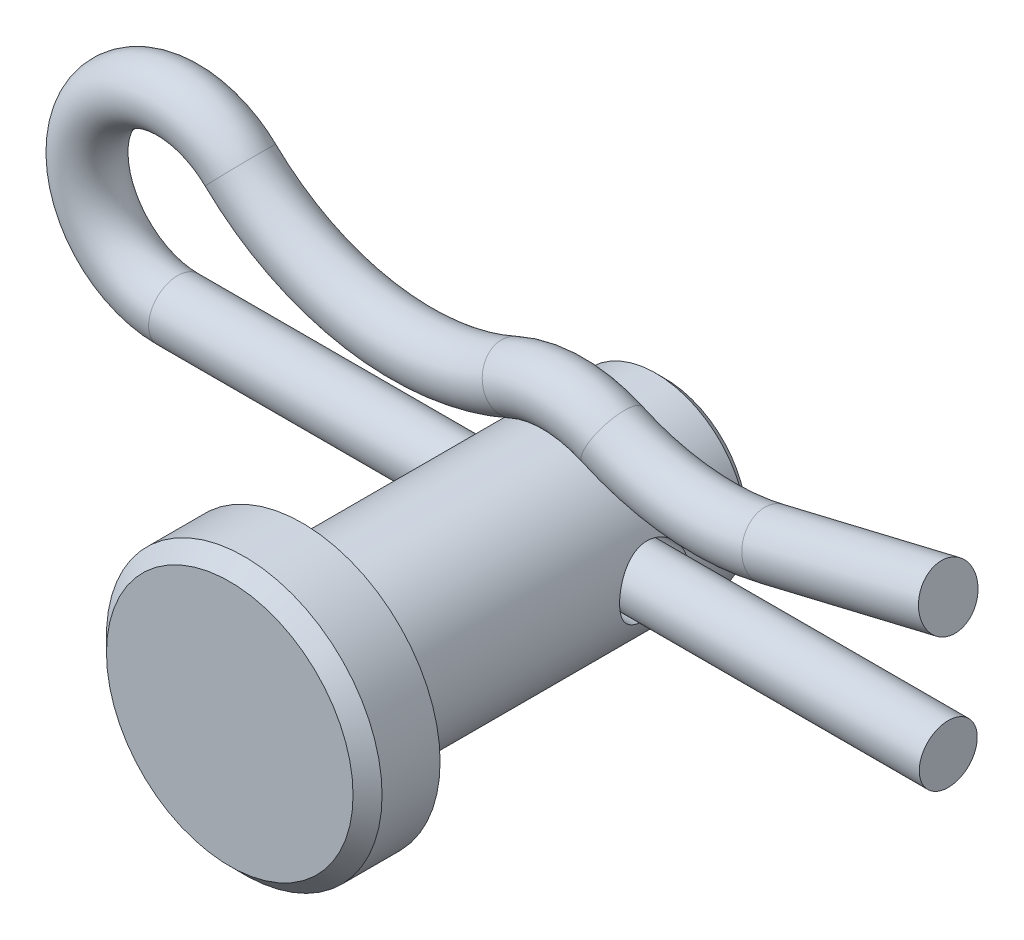
ISO-10303-21;
HEADER;
FILE_DESCRIPTION(('STEP AP214'),'2;1');
FILE_NAME('part.step','',(''),(''),'','','');
FILE_SCHEMA(('AUTOMOTIVE_DESIGN { 1 0 10303 214 1 1 1 1 }'));
ENDSEC;
DATA;
#1=APPLICATION_CONTEXT('core data for automotive mechanical design processes');
#2=APPLICATION_PROTOCOL_DEFINITION('international standard','automotive_design',2000,#1);
#3=PRODUCT_CONTEXT('',#1,'mechanical');
#4=PRODUCT('Part','Part','',(#3));
#5=PRODUCT_RELATED_PRODUCT_CATEGORY('part','',(#4));
#6=PRODUCT_DEFINITION_FORMATION('','',#4);
#7=PRODUCT_DEFINITION_CONTEXT('part definition',#1,'design');
#8=PRODUCT_DEFINITION('design','',#6,#7);
#9=PRODUCT_DEFINITION_SHAPE('','',#8);
#10=(LENGTH_UNIT() NAMED_UNIT(*) SI_UNIT(.MILLI.,.METRE.));
#11=(NAMED_UNIT(*) PLANE_ANGLE_UNIT() SI_UNIT($,.RADIAN.));
#12=(NAMED_UNIT(*) SI_UNIT($,.STERADIAN.) SOLID_ANGLE_UNIT());
#13=UNCERTAINTY_MEASURE_WITH_UNIT(LENGTH_MEASURE(1.E-05),#10,'distance_accuracy_value','');
#14=(GEOMETRIC_REPRESENTATION_CONTEXT(3) GLOBAL_UNCERTAINTY_ASSIGNED_CONTEXT((#13)) GLOBAL_UNIT_ASSIGNED_CONTEXT((#10,
#11,#12)) REPRESENTATION_CONTEXT('',''));
#15=CARTESIAN_POINT('',(0.,0.,0.));
#16=DIRECTION('',(0.,0.,1.));
#17=DIRECTION('',(1.,0.,0.));
#18=AXIS2_PLACEMENT_3D('',#15,#16,#17);
#19=CARTESIAN_POINT('',(7.30602677817418,3.28466385983467,-2.778125));
#20=DIRECTION('',(0.972644161927348,0.232300095283337,0.));
#21=DIRECTION('',(-0.232300095283337,0.972644161927348,0.));
#22=AXIS2_PLACEMENT_3D('',#19,#20,#21);
#23=CYLINDRICAL_SURFACE('',#22,1.016);
#24=CARTESIAN_POINT('',(7.30602677817418,3.28466385983467,-2.778125));
#25=DIRECTION('',(0.972644161927351,0.232300095283325,0.));
#26=DIRECTION('',(-0.232300095283325,0.972644161927351,0.));
#27=AXIS2_PLACEMENT_3D('',#24,#25,#26);
#28=CIRCLE('',#27,1.016);
#29=CARTESIAN_POINT('',(7.54204367498205,2.29645739131648,-2.778125));
#30=VERTEX_POINT('',#29);
#31=EDGE_CURVE('E44',#30,#30,#28,.T.);
#32=ORIENTED_EDGE('',*,*,#31,.T.);
#33=EDGE_LOOP('',(#32));
#34=FACE_BOUND('',#33,.T.);
#35=CARTESIAN_POINT('',(13.49375,4.76250000000001,-2.778125));
#36=DIRECTION('',(0.972644161927351,0.232300095283325,0.));
#37=DIRECTION('',(-0.232300095283325,0.972644161927351,0.));
#38=AXIS2_PLACEMENT_3D('',#35,#36,#37);
#39=CIRCLE('',#38,1.016);
#40=CARTESIAN_POINT('',(13.2577331031922,5.7507064685182,-2.778125));
#41=VERTEX_POINT('',#40);
#42=EDGE_CURVE('E11',#41,#41,#39,.T.);
#43=ORIENTED_EDGE('',*,*,#42,.F.);
#44=EDGE_LOOP('',(#43));
#45=FACE_BOUND('',#44,.T.);
#46=ADVANCED_FACE('F38',(#34,#45),#23,.T.);
#47=CARTESIAN_POINT('',(5.29632643400247,11.6993108904257,-2.778125));
#48=DIRECTION('',(0.,0.,1.));
#49=DIRECTION('',(1.,0.,0.));
#50=AXIS2_PLACEMENT_3D('',#47,#48,#49);
#51=TOROIDAL_SURFACE('',#50,8.65131089042575,1.016);
#52=CARTESIAN_POINT('',(1.72841977384718,3.8179897963947,-2.778125));
#53=DIRECTION('',(0.910997326746529,-0.412412258135811,0.));
#54=DIRECTION('',(0.412412258135811,0.910997326746529,0.));
#55=AXIS2_PLACEMENT_3D('',#52,#53,#54);
#56=CIRCLE('',#55,1.016);
#57=CARTESIAN_POINT('',(1.30940891958121,2.89241651242022,-2.778125));
#58=VERTEX_POINT('',#57);
#59=EDGE_CURVE('E48',#58,#58,#56,.T.);
#60=CARTESIAN_POINT('',(5.29632643400247,11.6993108904257,-2.778125));
#61=DIRECTION('',(0.,0.,1.));
#62=DIRECTION('',(1.,0.,0.));
#63=AXIS2_PLACEMENT_3D('',#60,#61,#62);
#64=CIRCLE('',#63,9.66731089042575);
#65=EDGE_CURVE('',#58,#30,#64,.T.);
#66=ORIENTED_EDGE('',*,*,#59,.T.);
#67=ORIENTED_EDGE('',*,*,#31,.F.);
#68=ORIENTED_EDGE('',*,*,#65,.T.);
#69=ORIENTED_EDGE('',*,*,#65,.F.);
#70=EDGE_LOOP('',(#66,#68,#67,#69));
#71=FACE_BOUND('',#70,.T.);
#72=ADVANCED_FACE('F85',(#71),#51,.T.);
#73=CARTESIAN_POINT('',(0.,0.,-2.778125));
#74=DIRECTION('',(0.,0.,-1.));
#75=DIRECTION('',(-1.,0.,0.));
#76=AXIS2_PLACEMENT_3D('',#73,#74,#75);
#77=TOROIDAL_SURFACE('',#76,4.191,1.016);
#78=CARTESIAN_POINT('',(-1.7284197738471,3.81798979639474,-2.778125));
#79=DIRECTION('',(0.910997326746538,0.412412258135789,0.));
#80=DIRECTION('',(-0.412412258135789,0.910997326746538,0.));
#81=AXIS2_PLACEMENT_3D('',#78,#79,#80);
#82=CIRCLE('',#81,1.016);
#83=CARTESIAN_POINT('',(-1.30940891958112,2.89241651242027,-2.778125));
#84=VERTEX_POINT('',#83);
#85=EDGE_CURVE('E52',#84,#84,#82,.T.);
#86=ORIENTED_EDGE('',*,*,#85,.T.);
#87=EDGE_LOOP('',(#86));
#88=FACE_BOUND('',#87,.T.);
#89=ORIENTED_EDGE('',*,*,#59,.F.);
#90=EDGE_LOOP('',(#89));
#91=FACE_BOUND('',#90,.T.);
#92=ADVANCED_FACE('F89',(#88,#91),#77,.T.);
#93=CARTESIAN_POINT('',(-5.29632643400247,11.6993108904257,-2.778125));
#94=DIRECTION('',(0.,0.,1.));
#95=DIRECTION('',(1.,0.,0.));
#96=AXIS2_PLACEMENT_3D('',#93,#94,#95);
#97=TOROIDAL_SURFACE('',#96,8.65131089042574,1.016);
#98=CARTESIAN_POINT('',(-11.2929944082361,5.46351476405987,-2.778125));
#99=DIRECTION('',(0.720792051672401,-0.693151367484686,0.));
#100=DIRECTION('',(0.693151367484686,0.720792051672401,0.));
#101=AXIS2_PLACEMENT_3D('',#98,#99,#100);
#102=CIRCLE('',#101,1.016);
#103=CARTESIAN_POINT('',(-11.9972361976005,4.7311900395607,-2.778125));
#104=VERTEX_POINT('',#103);
#105=EDGE_CURVE('E57',#104,#104,#102,.T.);
#106=CARTESIAN_POINT('',(-5.29632643400247,11.6993108904257,-2.778125));
#107=DIRECTION('',(0.,0.,1.));
#108=DIRECTION('',(1.,0.,0.));
#109=AXIS2_PLACEMENT_3D('',#106,#107,#108);
#110=CIRCLE('',#109,9.66731089042575);
#111=EDGE_CURVE('',#104,#84,#110,.T.);
#112=ORIENTED_EDGE('',*,*,#105,.T.);
#113=ORIENTED_EDGE('',*,*,#85,.F.);
#114=ORIENTED_EDGE('',*,*,#111,.T.);
#115=ORIENTED_EDGE('',*,*,#111,.F.);
#116=EDGE_LOOP('',(#112,#114,#113,#115));
#117=FACE_BOUND('',#116,.T.);
#118=ADVANCED_FACE('F95',(#117),#97,.T.);
#119=CARTESIAN_POINT('',(-13.49375,3.175,-2.778125));
#120=DIRECTION('',(0.,0.,-1.));
#121=DIRECTION('',(-1.,0.,0.));
#122=AXIS2_PLACEMENT_3D('',#119,#120,#121);
#123=TOROIDAL_SURFACE('',#122,3.175,1.016);
#124=CARTESIAN_POINT('',(-13.49375,0.,-2.778125));
#125=DIRECTION('',(-1.,0.,0.));
#126=DIRECTION('',(0.,-1.,0.));
#127=AXIS2_PLACEMENT_3D('',#124,#125,#126);
#128=CIRCLE('',#127,1.016);
#129=CARTESIAN_POINT('',(-13.49375,-1.016,-2.778125));
#130=VERTEX_POINT('',#129);
#131=EDGE_CURVE('E60',#130,#130,#128,.T.);
#132=ORIENTED_EDGE('',*,*,#131,.T.);
#133=EDGE_LOOP('',(#132));
#134=FACE_BOUND('',#133,.T.);
#135=ORIENTED_EDGE('',*,*,#105,.F.);
#136=EDGE_LOOP('',(#135));
#137=FACE_BOUND('',#136,.T.);
#138=ADVANCED_FACE('F67',(#134,#137),#123,.T.);
#139=CARTESIAN_POINT('',(-13.49375,0.,-2.778125));
#140=DIRECTION('',(1.,0.,0.));
#141=DIRECTION('',(0.,0.,-1.));
#142=AXIS2_PLACEMENT_3D('',#139,#140,#141);
#143=CYLINDRICAL_SURFACE('',#142,1.016);
#144=ORIENTED_EDGE('',*,*,#131,.F.);
#145=EDGE_LOOP('',(#144));
#146=FACE_BOUND('',#145,.T.);
#147=CARTESIAN_POINT('',(13.49375,0.,-2.778125));
#148=DIRECTION('',(-1.,0.,0.));
#149=DIRECTION('',(0.,-1.,0.));
#150=AXIS2_PLACEMENT_3D('',#147,#148,#149);
#151=CIRCLE('',#150,1.016);
#152=CARTESIAN_POINT('',(13.49375,-1.016,-2.778125));
#153=VERTEX_POINT('',#152);
#154=EDGE_CURVE('E61',#153,#153,#151,.T.);
#155=ORIENTED_EDGE('',*,*,#154,.T.);
#156=EDGE_LOOP('',(#155));
#157=FACE_BOUND('',#156,.T.);
#158=ADVANCED_FACE('F70',(#146,#157),#143,.T.);
#159=CARTESIAN_POINT('',(13.49375,4.76250000000001,-2.778125));
#160=DIRECTION('',(0.972644161927351,0.232300095283325,0.));
#161=DIRECTION('',(-0.232300095283325,0.972644161927351,0.));
#162=AXIS2_PLACEMENT_3D('',#159,#160,#161);
#163=PLANE('',#162);
#164=ORIENTED_EDGE('',*,*,#42,.T.);
#165=EDGE_LOOP('',(#164));
#166=FACE_BOUND('',#165,.T.);
#167=ADVANCED_FACE('F73',(#166),#163,.T.);
#168=CARTESIAN_POINT('',(13.49375,0.,-2.778125));
#169=DIRECTION('',(-1.,0.,0.));
#170=DIRECTION('',(0.,-1.,0.));
#171=AXIS2_PLACEMENT_3D('',#168,#169,#170);
#172=PLANE('',#171);
#173=ORIENTED_EDGE('',*,*,#154,.F.);
#174=EDGE_LOOP('',(#173));
#175=FACE_BOUND('',#174,.T.);
#176=ADVANCED_FACE('F77',(#175),#172,.F.);
#177=CLOSED_SHELL('',(#46,#72,#92,#118,#138,#158,#167,#176));
#178=MANIFOLD_SOLID_BREP('B2',#177);
#179=CARTESIAN_POINT('',(0.,0.,6.35));
#180=DIRECTION('',(0.,0.,-1.));
#181=DIRECTION('',(-1.,0.,0.));
#182=AXIS2_PLACEMENT_3D('',#179,#180,#181);
#183=CYLINDRICAL_SURFACE('',#182,3.175);
#184=CARTESIAN_POINT('',(0.,0.,-6.03249999999999));
#185=DIRECTION('',(0.,0.,1.));
#186=DIRECTION('',(1.,0.,0.));
#187=AXIS2_PLACEMENT_3D('',#184,#185,#186);
#188=CIRCLE('',#187,3.175);
#189=CARTESIAN_POINT('',(3.175,0.,-6.03249999999999));
#190=VERTEX_POINT('',#189);
#191=EDGE_CURVE('E160',#190,#190,#188,.T.);
#192=ORIENTED_EDGE('',*,*,#191,.T.);
#193=EDGE_LOOP('',(#192));
#194=FACE_BOUND('',#193,.T.);
#195=CARTESIAN_POINT('',(-3.175,0.,-1.5875));
#196=CARTESIAN_POINT('',(-3.1750017260582,-0.0644803280319207,-1.5874976962969));
#197=CARTESIAN_POINT('',(-3.17301863556027,-0.128944879414297,-1.59275443469715));
#198=CARTESIAN_POINT('',(-3.16530589955499,-0.255947427804686,-1.6135573799955));
#199=CARTESIAN_POINT('',(-3.15957679372107,-0.31848570096517,-1.62910210474851));
#200=CARTESIAN_POINT('',(-3.14498698210789,-0.43978574808651,-1.66985394515633));
#201=CARTESIAN_POINT('',(-3.13613231952368,-0.498554552928807,-1.69504242272729));
#202=CARTESIAN_POINT('',(-3.11617334413749,-0.611028202439701,-1.75427196533131));
#203=CARTESIAN_POINT('',(-3.10506842811866,-0.664731683597442,-1.78831540477567));
#204=CARTESIAN_POINT('',(-3.08122833533403,-0.767831218530124,-1.86579869653753));
#205=CARTESIAN_POINT('',(-3.06844702050705,-0.816983642057508,-1.9095483956684));
#206=CARTESIAN_POINT('',(-3.04292175316616,-0.907450095452757,-2.00454453251046));
#207=CARTESIAN_POINT('',(-3.03017781325932,-0.94876172610117,-2.05579325639475));
#208=CARTESIAN_POINT('',(-3.00563336052824,-1.02392323008938,-2.16671323984655));
#209=CARTESIAN_POINT('',(-2.99388727501525,-1.05742893349134,-2.22663096594574));
#210=CARTESIAN_POINT('',(-2.97338639063463,-1.11377925527679,-2.35176088112126));
#211=CARTESIAN_POINT('',(-2.96463039737106,-1.13662813187984,-2.41697094325436));
#212=CARTESIAN_POINT('',(-2.95159440179158,-1.1700544212018,-2.54803016257995));
#213=CARTESIAN_POINT('',(-2.94714552453477,-1.1810967711723,-2.61374337425813));
#214=CARTESIAN_POINT('',(-2.94273336284839,-1.19205022996996,-2.74622907540761));
#215=CARTESIAN_POINT('',(-2.94276822592073,-1.19196593587088,-2.81300111601286));
#216=CARTESIAN_POINT('',(-2.94717399857943,-1.18102403502952,-2.94145456063778));
#217=CARTESIAN_POINT('',(-2.95128528416453,-1.17081148004022,-3.00320146917257));
#218=CARTESIAN_POINT('',(-2.96294919584751,-1.14096933245487,-3.12403105063422));
#219=CARTESIAN_POINT('',(-2.97050234018473,-1.12133832170211,-3.18311332087477));
#220=CARTESIAN_POINT('',(-2.98835526113513,-1.07286225428949,-3.29825117250928));
#221=CARTESIAN_POINT('',(-2.99870429903107,-1.04384989935074,-3.35422834210878));
#222=CARTESIAN_POINT('',(-3.02096654298085,-0.977551335491413,-3.46070692921283));
#223=CARTESIAN_POINT('',(-3.03288028850369,-0.940262269910616,-3.51120644715626));
#224=CARTESIAN_POINT('',(-3.05790630844421,-0.855517884834481,-3.60886665802288));
#225=CARTESIAN_POINT('',(-3.07104532042939,-0.807547746065834,-3.6555748585938));
#226=CARTESIAN_POINT('',(-3.09635309230243,-0.704304368962597,-3.74041826067585));
#227=CARTESIAN_POINT('',(-3.10852170288599,-0.649030010276032,-3.77855214459325));
#228=CARTESIAN_POINT('',(-3.13075950879707,-0.531592978112733,-3.84566350266838));
#229=CARTESIAN_POINT('',(-3.1407933299357,-0.469337004114246,-3.87449026759422));
#230=CARTESIAN_POINT('',(-3.15736857672026,-0.340389250103888,-3.92111119213934));
#231=CARTESIAN_POINT('',(-3.1639115533356,-0.273699454858828,-3.93891025189539));
#232=CARTESIAN_POINT('',(-3.17249526812277,-0.141585349249253,-3.96210058761141));
#233=CARTESIAN_POINT('',(-3.17475686664138,-0.0762822480275035,-3.96810119381612));
#234=CARTESIAN_POINT('',(-3.17520553124475,0.0544294022336755,-3.96929853197056));
#235=CARTESIAN_POINT('',(-3.17339350069573,0.119837924680552,-3.96449765925144));
#236=CARTESIAN_POINT('',(-3.16604419632035,0.246270501045976,-3.94469140391749));
#237=CARTESIAN_POINT('',(-3.16065273826329,0.307366454105823,-3.93008521215869));
#238=CARTESIAN_POINT('',(-3.1468335994155,0.426197517997294,-3.89160855491556));
#239=CARTESIAN_POINT('',(-3.13840552373861,0.483932190588355,-3.86773688450375));
#240=CARTESIAN_POINT('',(-3.11903764373597,0.596302913556186,-3.81064578512617));
#241=CARTESIAN_POINT('',(-3.1080313141617,0.650798072574,-3.77717230242894));
#242=CARTESIAN_POINT('',(-3.08472420554452,0.753580464933009,-3.70211500560758));
#243=CARTESIAN_POINT('',(-3.07242294938803,0.80186539546467,-3.66052819729228));
#244=CARTESIAN_POINT('',(-3.04699455283473,0.893786946503481,-3.56758547806386));
#245=CARTESIAN_POINT('',(-3.03386090349835,0.936991348355825,-3.51580276742417));
#246=CARTESIAN_POINT('',(-3.00893809999065,1.01418270962823,-3.4054642133883));
#247=CARTESIAN_POINT('',(-2.99714906660554,1.04816884135274,-3.34690776246038));
#248=CARTESIAN_POINT('',(-2.9762992117158,1.10599357730704,-3.22419981049948));
#249=CARTESIAN_POINT('',(-2.96724991010742,1.12978950323491,-3.16002610793359));
#250=CARTESIAN_POINT('',(-2.95317888607235,1.16608132501843,-3.02814850007279));
#251=CARTESIAN_POINT('',(-2.94815467214383,1.17858421180018,-2.96044680626774));
#252=CARTESIAN_POINT('',(-2.94303366491605,1.1913103800891,-2.82811842336424));
#253=CARTESIAN_POINT('',(-2.94264115340402,1.19227069374821,-2.76357347357472));
#254=CARTESIAN_POINT('',(-2.94606990116576,1.18377268040514,-2.63529340520579));
#255=CARTESIAN_POINT('',(-2.94989076088501,1.17431534131036,-2.57155821041693));
#256=CARTESIAN_POINT('',(-2.96106962383437,1.14582428656504,-2.44868126379374));
#257=CARTESIAN_POINT('',(-2.96831611517726,1.12709164913741,-2.38945868766776));
#258=CARTESIAN_POINT('',(-2.98546478961414,1.08084696819061,-2.27496250263255));
#259=CARTESIAN_POINT('',(-2.99536764396202,1.0533327052505,-2.21968989634432));
#260=CARTESIAN_POINT('',(-3.01735905848772,0.988632102759095,-2.1115124856775));
#261=CARTESIAN_POINT('',(-3.02953498137515,0.951014360373893,-2.05888368004007));
#262=CARTESIAN_POINT('',(-3.0543995836351,0.867842480481129,-1.96045013597911));
#263=CARTESIAN_POINT('',(-3.06708842498621,0.822285820601665,-1.91464757501301));
#264=CARTESIAN_POINT('',(-3.09237399534093,0.721582564947794,-1.82863969756641));
#265=CARTESIAN_POINT('',(-3.10492858264887,0.666050423844062,-1.78887139571123));
#266=CARTESIAN_POINT('',(-3.12780770850268,0.548650495915651,-1.71924451737423));
#267=CARTESIAN_POINT('',(-3.13813207344675,0.48678221643443,-1.68938671223426));
#268=CARTESIAN_POINT('',(-3.15574594756552,0.355599271339335,-1.63958839194289));
#269=CARTESIAN_POINT('',(-3.16288465369445,0.286078153898403,-1.62013339247224));
#270=CARTESIAN_POINT('',(-3.17250954730047,0.144363863550066,-1.59409371306296));
#271=CARTESIAN_POINT('',(-3.17499806804399,0.0721720492396068,-1.58750257850694));
#272=CARTESIAN_POINT('',(-3.175,0.,-1.5875));
#273=B_SPLINE_CURVE_WITH_KNOTS('',3,(#195,#196,#197,#198,#199,#200,#201,#202,#203,#204,#205,
#206,#207,#208,#209,#210,#211,#212,#213,#214,#215,#216,#217,#218,#219,#220,#221,#222,#223,#224,
#225,#226,#227,#228,#229,#230,#231,#232,#233,#234,#235,#236,#237,#238,#239,#240,#241,#242,#243,
#244,#245,#246,#247,#248,#249,#250,#251,#252,#253,#254,#255,#256,#257,#258,#259,#260,#261,#262,
#263,#264,#265,#266,#267,#268,#269,#270,#271,#272),.UNSPECIFIED.,.T.,.F.,(4,2,2,2,2,2,2,2,2,2,2,
2,2,2,2,2,2,2,2,2,2,2,2,2,2,2,2,2,2,2,2,2,2,2,2,2,2,2,4),(0.,0.193174779988694,
0.386321736189803,0.579097274313273,0.771924557565032,0.972134347500303,1.17240530159712,
1.38030485385691,1.58812126298256,1.78741287818415,1.98662215450767,2.17390936438977,
2.36122478335592,2.55208411657196,2.74300942653255,2.94676634210301,3.15055454712146,
3.35749404133322,3.56434151635959,3.76019234336016,3.95599974284976,4.14428335102048,
4.33259145270722,4.52643257351057,4.7203453664077,4.92550862317928,5.13069029517862,
5.33672309214718,5.54262825746727,5.7353101851245,5.92797384230187,6.11475744301061,
6.30158828783602,6.4982127455814,6.69489978960168,6.90223036662893,7.109577076578,
7.32590383806683,7.54212202675676),.UNSPECIFIED.);
#274=CARTESIAN_POINT('',(-3.175,0.,-1.5875));
#275=VERTEX_POINT('',#274);
#276=EDGE_CURVE('E171',#275,#275,#273,.T.);
#277=ORIENTED_EDGE('',*,*,#276,.T.);
#278=EDGE_LOOP('',(#277));
#279=FACE_BOUND('',#278,.T.);
#280=CARTESIAN_POINT('',(3.175,0.,-3.96875));
#281=CARTESIAN_POINT('',(3.1750017260582,-0.0644803280319207,-3.96875230370309));
#282=CARTESIAN_POINT('',(3.17301863556027,-0.128944879414297,-3.96349556530285));
#283=CARTESIAN_POINT('',(3.16530589955499,-0.255947427804686,-3.94269262000449));
#284=CARTESIAN_POINT('',(3.15957679372107,-0.31848570096517,-3.92714789525149));
#285=CARTESIAN_POINT('',(3.14498698210789,-0.43978574808651,-3.88639605484366));
#286=CARTESIAN_POINT('',(3.13613231952368,-0.498554552928807,-3.86120757727271));
#287=CARTESIAN_POINT('',(3.11617334413749,-0.611028202439701,-3.80197803466869));
#288=CARTESIAN_POINT('',(3.10506842811866,-0.664731683597442,-3.76793459522433));
#289=CARTESIAN_POINT('',(3.08122833533403,-0.767831218530124,-3.69045130346247));
#290=CARTESIAN_POINT('',(3.06844702050705,-0.816983642057508,-3.6467016043316));
#291=CARTESIAN_POINT('',(3.04292175316616,-0.907450095452756,-3.55170546748954));
#292=CARTESIAN_POINT('',(3.03017781325932,-0.94876172610117,-3.50045674360525));
#293=CARTESIAN_POINT('',(3.00563336052824,-1.02392323008938,-3.38953676015345));
#294=CARTESIAN_POINT('',(2.99388727501525,-1.05742893349134,-3.32961903405426));
#295=CARTESIAN_POINT('',(2.97338639063463,-1.11377925527679,-3.20448911887873));
#296=CARTESIAN_POINT('',(2.96463039737106,-1.13662813187984,-3.13927905674564));
#297=CARTESIAN_POINT('',(2.95159440179158,-1.1700544212018,-3.00821983742005));
#298=CARTESIAN_POINT('',(2.94714552453477,-1.1810967711723,-2.94250662574187));
#299=CARTESIAN_POINT('',(2.94273336284839,-1.19205022996996,-2.81002092459239));
#300=CARTESIAN_POINT('',(2.94276822592073,-1.19196593587088,-2.74324888398714));
#301=CARTESIAN_POINT('',(2.94717399857943,-1.18102403502952,-2.61479543936221));
#302=CARTESIAN_POINT('',(2.95128528416453,-1.17081148004021,-2.55304853082743));
#303=CARTESIAN_POINT('',(2.96294919584751,-1.14096933245487,-2.43221894936578));
#304=CARTESIAN_POINT('',(2.97050234018473,-1.12133832170211,-2.37313667912523));
#305=CARTESIAN_POINT('',(2.98835526113513,-1.07286225428949,-2.25799882749072));
#306=CARTESIAN_POINT('',(2.99870429903107,-1.04384989935074,-2.20202165789122));
#307=CARTESIAN_POINT('',(3.02096654298085,-0.977551335491413,-2.09554307078717));
#308=CARTESIAN_POINT('',(3.03288028850369,-0.940262269910617,-2.04504355284374));
#309=CARTESIAN_POINT('',(3.05790630844421,-0.855517884834481,-1.94738334197712));
#310=CARTESIAN_POINT('',(3.07104532042939,-0.807547746065834,-1.9006751414062));
#311=CARTESIAN_POINT('',(3.09635309230243,-0.704304368962598,-1.81583173932415));
#312=CARTESIAN_POINT('',(3.10852170288599,-0.649030010276033,-1.77769785540675));
#313=CARTESIAN_POINT('',(3.13075950879707,-0.531592978112733,-1.71058649733162));
#314=CARTESIAN_POINT('',(3.1407933299357,-0.469337004114246,-1.68175973240578));
#315=CARTESIAN_POINT('',(3.15736857672026,-0.340389250103888,-1.63513880786065));
#316=CARTESIAN_POINT('',(3.1639115533356,-0.273699454858828,-1.61733974810461));
#317=CARTESIAN_POINT('',(3.17249526812277,-0.141585349249253,-1.59414941238858));
#318=CARTESIAN_POINT('',(3.17475686664138,-0.0762822480275038,-1.58814880618388));
#319=CARTESIAN_POINT('',(3.17520553124475,0.0544294022336755,-1.58695146802944));
#320=CARTESIAN_POINT('',(3.17339350069573,0.119837924680552,-1.59175234074856));
#321=CARTESIAN_POINT('',(3.16604419632035,0.246270501045976,-1.61155859608251));
#322=CARTESIAN_POINT('',(3.16065273826329,0.307366454105823,-1.62616478784131));
#323=CARTESIAN_POINT('',(3.1468335994155,0.426197517997294,-1.66464144508444));
#324=CARTESIAN_POINT('',(3.13840552373861,0.483932190588355,-1.68851311549625));
#325=CARTESIAN_POINT('',(3.11903764373597,0.596302913556186,-1.74560421487383));
#326=CARTESIAN_POINT('',(3.1080313141617,0.650798072574,-1.77907769757106));
#327=CARTESIAN_POINT('',(3.08472420554452,0.753580464933009,-1.85413499439242));
#328=CARTESIAN_POINT('',(3.07242294938803,0.80186539546467,-1.89572180270771));
#329=CARTESIAN_POINT('',(3.04699455283473,0.893786946503481,-1.98866452193614));
#330=CARTESIAN_POINT('',(3.03386090349835,0.936991348355825,-2.04044723257583));
#331=CARTESIAN_POINT('',(3.00893809999065,1.01418270962823,-2.1507857866117));
#332=CARTESIAN_POINT('',(2.99714906660554,1.04816884135274,-2.20934223753962));
#333=CARTESIAN_POINT('',(2.9762992117158,1.10599357730704,-2.33205018950052));
#334=CARTESIAN_POINT('',(2.96724991010742,1.12978950323491,-2.39622389206641));
#335=CARTESIAN_POINT('',(2.95317888607235,1.16608132501843,-2.52810149992721));
#336=CARTESIAN_POINT('',(2.94815467214383,1.17858421180018,-2.59580319373226));
#337=CARTESIAN_POINT('',(2.94303366491605,1.1913103800891,-2.72813157663576));
#338=CARTESIAN_POINT('',(2.94264115340402,1.19227069374821,-2.79267652642528));
#339=CARTESIAN_POINT('',(2.94606990116576,1.18377268040514,-2.92095659479421));
#340=CARTESIAN_POINT('',(2.94989076088501,1.17431534131036,-2.98469178958307));
#341=CARTESIAN_POINT('',(2.96106962383437,1.14582428656504,-3.10756873620626));
#342=CARTESIAN_POINT('',(2.96831611517726,1.12709164913741,-3.16679131233224));
#343=CARTESIAN_POINT('',(2.98546478961414,1.08084696819061,-3.28128749736745));
#344=CARTESIAN_POINT('',(2.99536764396202,1.0533327052505,-3.33656010365568));
#345=CARTESIAN_POINT('',(3.01735905848772,0.988632102759095,-3.4447375143225));
#346=CARTESIAN_POINT('',(3.02953498137515,0.951014360373893,-3.49736631995993));
#347=CARTESIAN_POINT('',(3.0543995836351,0.867842480481129,-3.59579986402089));
#348=CARTESIAN_POINT('',(3.06708842498621,0.822285820601665,-3.64160242498698));
#349=CARTESIAN_POINT('',(3.09237399534093,0.721582564947794,-3.72761030243359));
#350=CARTESIAN_POINT('',(3.10492858264887,0.666050423844062,-3.76737860428877));
#351=CARTESIAN_POINT('',(3.12780770850268,0.548650495915651,-3.83700548262577));
#352=CARTESIAN_POINT('',(3.13813207344675,0.48678221643443,-3.86686328776574));
#353=CARTESIAN_POINT('',(3.15574594756552,0.355599271339335,-3.91666160805711));
#354=CARTESIAN_POINT('',(3.16288465369445,0.286078153898403,-3.93611660752775));
#355=CARTESIAN_POINT('',(3.17250954730047,0.144363863550066,-3.96215628693704));
#356=CARTESIAN_POINT('',(3.17499806804399,0.0721720492396069,-3.96874742149306));
#357=CARTESIAN_POINT('',(3.175,0.,-3.96875));
#358=B_SPLINE_CURVE_WITH_KNOTS('',3,(#280,#281,#282,#283,#284,#285,#286,#287,#288,#289,#290,
#291,#292,#293,#294,#295,#296,#297,#298,#299,#300,#301,#302,#303,#304,#305,#306,#307,#308,#309,
#310,#311,#312,#313,#314,#315,#316,#317,#318,#319,#320,#321,#322,#323,#324,#325,#326,#327,#328,
#329,#330,#331,#332,#333,#334,#335,#336,#337,#338,#339,#340,#341,#342,#343,#344,#345,#346,#347,
#348,#349,#350,#351,#352,#353,#354,#355,#356,#357),.UNSPECIFIED.,.T.,.F.,(4,2,2,2,2,2,2,2,2,2,2,
2,2,2,2,2,2,2,2,2,2,2,2,2,2,2,2,2,2,2,2,2,2,2,2,2,2,2,4),(0.,0.193174779988694,
0.386321736189803,0.579097274313273,0.771924557565033,0.972134347500303,1.17240530159712,
1.38030485385692,1.58812126298256,1.78741287818415,1.98662215450767,2.17390936438977,
2.36122478335593,2.55208411657196,2.74300942653255,2.94676634210301,3.15055454712146,
3.35749404133322,3.56434151635959,3.76019234336016,3.95599974284976,4.14428335102048,
4.33259145270722,4.52643257351057,4.7203453664077,4.92550862317928,5.13069029517862,
5.33672309214718,5.54262825746727,5.7353101851245,5.92797384230187,6.11475744301061,
6.30158828783602,6.4982127455814,6.69489978960168,6.90223036662894,7.109577076578,
7.32590383806683,7.54212202675676),.UNSPECIFIED.);
#359=CARTESIAN_POINT('',(3.175,0.,-3.96875));
#360=VERTEX_POINT('',#359);
#361=EDGE_CURVE('E180',#360,#360,#358,.T.);
#362=ORIENTED_EDGE('',*,*,#361,.T.);
#363=EDGE_LOOP('',(#362));
#364=FACE_BOUND('',#363,.T.);
#365=CARTESIAN_POINT('',(0.,0.,6.35));
#366=DIRECTION('',(0.,0.,1.));
#367=DIRECTION('',(1.,0.,0.));
#368=AXIS2_PLACEMENT_3D('',#365,#366,#367);
#369=CIRCLE('',#368,3.175);
#370=CARTESIAN_POINT('',(3.175,0.,6.35));
#371=VERTEX_POINT('',#370);
#372=EDGE_CURVE('E219',#371,#371,#369,.T.);
#373=ORIENTED_EDGE('',*,*,#372,.F.);
#374=EDGE_LOOP('',(#373));
#375=FACE_BOUND('',#374,.T.);
#376=ADVANCED_FACE('F153',(#194,#279,#364,#375),#183,.T.);
#377=CARTESIAN_POINT('',(0.,0.,-6.35));
#378=DIRECTION('',(0.,0.,1.));
#379=DIRECTION('',(1.,0.,0.));
#380=AXIS2_PLACEMENT_3D('',#377,#378,#379);
#381=PLANE('',#380);
#382=CARTESIAN_POINT('',(0.,0.,-6.35));
#383=DIRECTION('',(0.,0.,1.));
#384=DIRECTION('',(1.,0.,0.));
#385=AXIS2_PLACEMENT_3D('',#382,#383,#384);
#386=CIRCLE('',#385,2.85749999999999);
#387=CARTESIAN_POINT('',(2.85749999999999,0.,-6.35));
#388=VERTEX_POINT('',#387);
#389=EDGE_CURVE('E37',#388,#388,#386,.F.);
#390=ORIENTED_EDGE('',*,*,#389,.T.);
#391=EDGE_LOOP('',(#390));
#392=FACE_BOUND('',#391,.T.);
#393=ADVANCED_FACE('F201',(#392),#381,.F.);
#394=CARTESIAN_POINT('',(0.,0.,6.35));
#395=DIRECTION('',(0.,0.,1.));
#396=DIRECTION('',(1.,0.,0.));
#397=AXIS2_PLACEMENT_3D('',#394,#395,#396);
#398=PLANE('',#397);
#399=CARTESIAN_POINT('',(0.,0.,6.35));
#400=DIRECTION('',(0.,0.,1.));
#401=DIRECTION('',(1.,0.,0.));
#402=AXIS2_PLACEMENT_3D('',#399,#400,#401);
#403=CIRCLE('',#402,4.826);
#404=CARTESIAN_POINT('',(4.826,0.,6.35));
#405=VERTEX_POINT('',#404);
#406=EDGE_CURVE('E179',#405,#405,#403,.T.);
#407=ORIENTED_EDGE('',*,*,#406,.F.);
#408=EDGE_LOOP('',(#407));
#409=FACE_BOUND('',#408,.T.);
#410=ORIENTED_EDGE('',*,*,#372,.T.);
#411=EDGE_LOOP('',(#410));
#412=FACE_BOUND('',#411,.T.);
#413=ADVANCED_FACE('F198',(#409,#412),#398,.F.);
#414=CARTESIAN_POINT('',(0.,0.,8.89));
#415=DIRECTION('',(0.,0.,-1.));
#416=DIRECTION('',(-1.,0.,0.));
#417=AXIS2_PLACEMENT_3D('',#414,#415,#416);
#418=CYLINDRICAL_SURFACE('',#417,4.826);
#419=CARTESIAN_POINT('',(0.,0.,8.382));
#420=DIRECTION('',(0.,0.,1.));
#421=DIRECTION('',(1.,0.,0.));
#422=AXIS2_PLACEMENT_3D('',#419,#420,#421);
#423=CIRCLE('',#422,4.826);
#424=CARTESIAN_POINT('',(4.826,0.,8.382));
#425=VERTEX_POINT('',#424);
#426=EDGE_CURVE('E164',#425,#425,#423,.F.);
#427=ORIENTED_EDGE('',*,*,#426,.T.);
#428=EDGE_LOOP('',(#427));
#429=FACE_BOUND('',#428,.T.);
#430=ORIENTED_EDGE('',*,*,#406,.T.);
#431=EDGE_LOOP('',(#430));
#432=FACE_BOUND('',#431,.T.);
#433=ADVANCED_FACE('F196',(#429,#432),#418,.T.);
#434=CARTESIAN_POINT('',(0.,0.,8.89));
#435=DIRECTION('',(0.,0.,1.));
#436=DIRECTION('',(1.,0.,0.));
#437=AXIS2_PLACEMENT_3D('',#434,#435,#436);
#438=PLANE('',#437);
#439=CARTESIAN_POINT('',(0.,0.,8.89));
#440=DIRECTION('',(0.,0.,1.));
#441=DIRECTION('',(1.,0.,0.));
#442=AXIS2_PLACEMENT_3D('',#439,#440,#441);
#443=CIRCLE('',#442,4.318);
#444=CARTESIAN_POINT('',(4.318,0.,8.89));
#445=VERTEX_POINT('',#444);
#446=EDGE_CURVE('E168',#445,#445,#443,.T.);
#447=ORIENTED_EDGE('',*,*,#446,.T.);
#448=EDGE_LOOP('',(#447));
#449=FACE_BOUND('',#448,.T.);
#450=ADVANCED_FACE('F192',(#449),#438,.T.);
#451=CARTESIAN_POINT('',(0.,0.,8.89));
#452=DIRECTION('',(0.,0.,-1.));
#453=DIRECTION('',(-1.,0.,0.));
#454=AXIS2_PLACEMENT_3D('',#451,#452,#453);
#455=CONICAL_SURFACE('',#454,4.318,0.785398163397447);
#456=ORIENTED_EDGE('',*,*,#426,.F.);
#457=EDGE_LOOP('',(#456));
#458=FACE_BOUND('',#457,.T.);
#459=ORIENTED_EDGE('',*,*,#446,.F.);
#460=EDGE_LOOP('',(#459));
#461=FACE_BOUND('',#460,.T.);
#462=ADVANCED_FACE('F190',(#458,#461),#455,.T.);
#463=CARTESIAN_POINT('',(-4.826,0.,-2.778125));
#464=DIRECTION('',(1.,0.,0.));
#465=DIRECTION('',(0.,0.,-1.));
#466=AXIS2_PLACEMENT_3D('',#463,#464,#465);
#467=CYLINDRICAL_SURFACE('',#466,1.190625);
#468=ORIENTED_EDGE('',*,*,#361,.F.);
#469=EDGE_LOOP('',(#468));
#470=FACE_BOUND('',#469,.T.);
#471=ORIENTED_EDGE('',*,*,#276,.F.);
#472=EDGE_LOOP('',(#471));
#473=FACE_BOUND('',#472,.T.);
#474=ADVANCED_FACE('F186',(#470,#473),#467,.F.);
#475=CARTESIAN_POINT('',(0.,0.,-6.03249999999999));
#476=DIRECTION('',(0.,0.,1.));
#477=DIRECTION('',(1.,0.,0.));
#478=AXIS2_PLACEMENT_3D('',#475,#476,#477);
#479=CONICAL_SURFACE('',#478,3.175,0.785398163397449);
#480=ORIENTED_EDGE('',*,*,#389,.F.);
#481=EDGE_LOOP('',(#480));
#482=FACE_BOUND('',#481,.T.);
#483=ORIENTED_EDGE('',*,*,#191,.F.);
#484=EDGE_LOOP('',(#483));
#485=FACE_BOUND('',#484,.T.);
#486=ADVANCED_FACE('F155',(#482,#485),#479,.T.);
#487=CLOSED_SHELL('',(#376,#393,#413,#433,#450,#462,#474,#486));
#488=MANIFOLD_SOLID_BREP('B6',#487);
#489=ADVANCED_BREP_SHAPE_REPRESENTATION('',(#18,#178,#488),#14);
#490=SHAPE_DEFINITION_REPRESENTATION(#9,#489);
ENDSEC;
END-ISO-10303-21;
